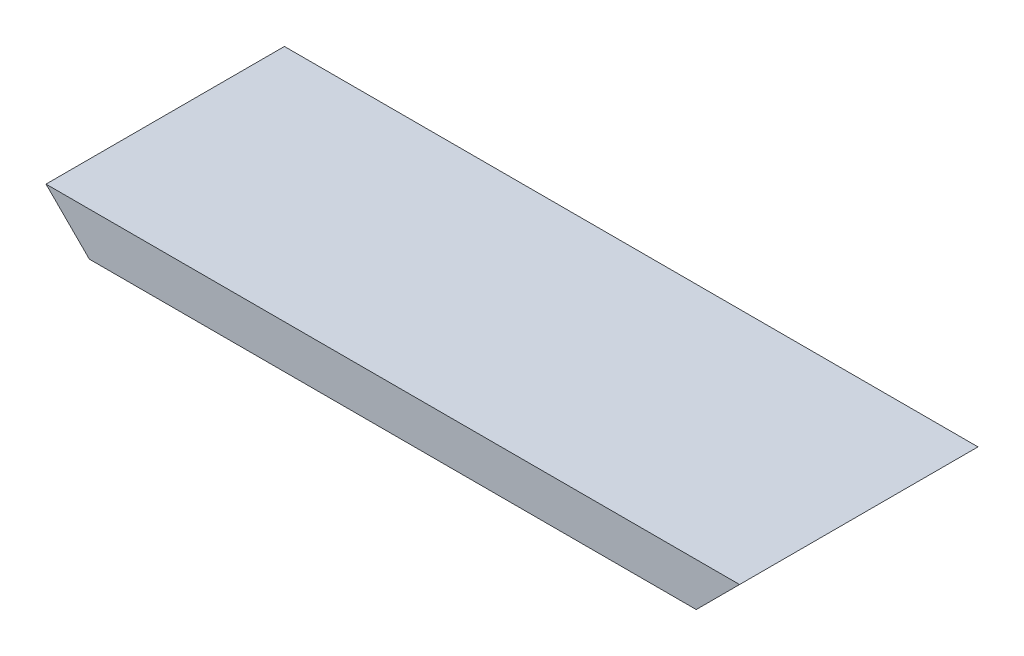
ISO-10303-21;
HEADER;
FILE_DESCRIPTION(('STEP AP214'),'2;1');
FILE_NAME('part.step','',(''),(''),'','','');
FILE_SCHEMA(('AUTOMOTIVE_DESIGN { 1 0 10303 214 1 1 1 1 }'));
ENDSEC;
DATA;
#1=APPLICATION_CONTEXT('core data for automotive mechanical design processes');
#2=APPLICATION_PROTOCOL_DEFINITION('international standard','automotive_design',2000,#1);
#3=PRODUCT_CONTEXT('',#1,'mechanical');
#4=PRODUCT('Part','Part','',(#3));
#5=PRODUCT_RELATED_PRODUCT_CATEGORY('part','',(#4));
#6=PRODUCT_DEFINITION_FORMATION('','',#4);
#7=PRODUCT_DEFINITION_CONTEXT('part definition',#1,'design');
#8=PRODUCT_DEFINITION('design','',#6,#7);
#9=PRODUCT_DEFINITION_SHAPE('','',#8);
#10=(LENGTH_UNIT() NAMED_UNIT(*) SI_UNIT(.MILLI.,.METRE.));
#11=(NAMED_UNIT(*) PLANE_ANGLE_UNIT() SI_UNIT($,.RADIAN.));
#12=(NAMED_UNIT(*) SI_UNIT($,.STERADIAN.) SOLID_ANGLE_UNIT());
#13=UNCERTAINTY_MEASURE_WITH_UNIT(LENGTH_MEASURE(1.E-05),#10,'distance_accuracy_value','');
#14=(GEOMETRIC_REPRESENTATION_CONTEXT(3) GLOBAL_UNCERTAINTY_ASSIGNED_CONTEXT((#13)) GLOBAL_UNIT_ASSIGNED_CONTEXT((#10,
#11,#12)) REPRESENTATION_CONTEXT('',''));
#15=CARTESIAN_POINT('',(0.,0.,0.));
#16=DIRECTION('',(0.,0.,1.));
#17=DIRECTION('',(1.,0.,0.));
#18=AXIS2_PLACEMENT_3D('',#15,#16,#17);
#19=CARTESIAN_POINT('',(-101.6,-6.35,69.85));
#20=DIRECTION('',(0.,1.,0.));
#21=DIRECTION('',(0.,0.,1.));
#22=AXIS2_PLACEMENT_3D('',#19,#20,#21);
#23=PLANE('',#22);
#24=DIRECTION('',(0.,0.,-1.));
#25=VECTOR('',#24,1.);
#26=CARTESIAN_POINT('',(-88.9,-6.35,69.85));
#27=LINE('',#26,#25);
#28=CARTESIAN_POINT('',(-88.9,-6.35,63.5));
#29=VERTEX_POINT('',#28);
#30=CARTESIAN_POINT('',(-88.9,-6.35,57.15));
#31=VERTEX_POINT('',#30);
#32=EDGE_CURVE('E171',#29,#31,#27,.T.);
#33=ORIENTED_EDGE('',*,*,#32,.T.);
#34=DIRECTION('',(-1.,0.,0.));
#35=VECTOR('',#34,1.);
#36=CARTESIAN_POINT('',(-101.6,-6.35,57.15));
#37=LINE('',#36,#35);
#38=CARTESIAN_POINT('',(88.8999999999999,-6.35,57.15));
#39=VERTEX_POINT('',#38);
#40=EDGE_CURVE('E164',#39,#31,#37,.T.);
#41=ORIENTED_EDGE('',*,*,#40,.F.);
#42=DIRECTION('',(0.,0.,1.));
#43=VECTOR('',#42,1.);
#44=CARTESIAN_POINT('',(88.8999999999999,-6.35,69.85));
#45=LINE('',#44,#43);
#46=CARTESIAN_POINT('',(88.8999999999999,-6.35,63.5));
#47=VERTEX_POINT('',#46);
#48=EDGE_CURVE('E276',#39,#47,#45,.T.);
#49=ORIENTED_EDGE('',*,*,#48,.T.);
#50=DIRECTION('',(1.,0.,0.));
#51=VECTOR('',#50,1.);
#52=CARTESIAN_POINT('',(-101.6,-6.35,63.5));
#53=LINE('',#52,#51);
#54=EDGE_CURVE('E242',#29,#47,#53,.T.);
#55=ORIENTED_EDGE('',*,*,#54,.F.);
#56=EDGE_LOOP('',(#33,#41,#49,#55));
#57=FACE_BOUND('',#56,.T.);
#58=ADVANCED_FACE('F34',(#57),#23,.F.);
#59=CARTESIAN_POINT('',(88.8999999999999,-6.35,6.175000096));
#60=VERTEX_POINT('',#59);
#61=CARTESIAN_POINT('',(88.8999999999999,-6.35,54.149999904));
#62=VERTEX_POINT('',#61);
#63=EDGE_CURVE('E163',#60,#62,#45,.T.);
#64=ORIENTED_EDGE('',*,*,#63,.T.);
#65=DIRECTION('',(1.,0.,0.));
#66=VECTOR('',#65,1.);
#67=CARTESIAN_POINT('',(-101.6,-6.35,54.149999904));
#68=LINE('',#67,#66);
#69=CARTESIAN_POINT('',(-88.9,-6.35,54.149999904));
#70=VERTEX_POINT('',#69);
#71=EDGE_CURVE('E148',#70,#62,#68,.T.);
#72=ORIENTED_EDGE('',*,*,#71,.F.);
#73=CARTESIAN_POINT('',(-88.9,-6.35,6.175000096));
#74=VERTEX_POINT('',#73);
#75=EDGE_CURVE('E160',#70,#74,#27,.T.);
#76=ORIENTED_EDGE('',*,*,#75,.T.);
#77=DIRECTION('',(-1.,0.,0.));
#78=VECTOR('',#77,1.);
#79=CARTESIAN_POINT('',(-101.6,-6.35,6.175000096));
#80=LINE('',#79,#78);
#81=EDGE_CURVE('E232',#60,#74,#80,.T.);
#82=ORIENTED_EDGE('',*,*,#81,.F.);
#83=EDGE_LOOP('',(#64,#72,#76,#82));
#84=FACE_BOUND('',#83,.T.);
#85=ADVANCED_FACE('F158',(#84),#23,.F.);
#86=CARTESIAN_POINT('',(-88.9,-6.35,69.85));
#87=VERTEX_POINT('',#86);
#88=CARTESIAN_POINT('',(-88.9,-6.35,66.675));
#89=VERTEX_POINT('',#88);
#90=EDGE_CURVE('E174',#87,#89,#27,.T.);
#91=ORIENTED_EDGE('',*,*,#90,.T.);
#92=DIRECTION('',(-1.,0.,0.));
#93=VECTOR('',#92,1.);
#94=CARTESIAN_POINT('',(-101.6,-6.35,66.675));
#95=LINE('',#94,#93);
#96=CARTESIAN_POINT('',(88.8999999999999,-6.35,66.675));
#97=VERTEX_POINT('',#96);
#98=EDGE_CURVE('E246',#97,#89,#95,.T.);
#99=ORIENTED_EDGE('',*,*,#98,.F.);
#100=CARTESIAN_POINT('',(88.8999999999999,-6.35000000000001,69.85));
#101=VERTEX_POINT('',#100);
#102=EDGE_CURVE('E274',#97,#101,#45,.T.);
#103=ORIENTED_EDGE('',*,*,#102,.T.);
#104=DIRECTION('',(1.,0.,0.));
#105=VECTOR('',#104,1.);
#106=CARTESIAN_POINT('',(-101.6,-6.35,69.85));
#107=LINE('',#106,#105);
#108=EDGE_CURVE('E262',#87,#101,#107,.T.);
#109=ORIENTED_EDGE('',*,*,#108,.F.);
#110=EDGE_LOOP('',(#91,#99,#103,#109));
#111=FACE_BOUND('',#110,.T.);
#112=ADVANCED_FACE('F281',(#111),#23,.F.);
#113=CARTESIAN_POINT('',(-101.6,6.35,69.85));
#114=DIRECTION('',(0.,-1.,0.));
#115=DIRECTION('',(0.,0.,-1.));
#116=AXIS2_PLACEMENT_3D('',#113,#114,#115);
#117=PLANE('',#116);
#118=DIRECTION('',(-1.,0.,0.));
#119=VECTOR('',#118,1.);
#120=CARTESIAN_POINT('',(-101.6,6.35,0.));
#121=LINE('',#120,#119);
#122=CARTESIAN_POINT('',(101.6,6.35,0.));
#123=VERTEX_POINT('',#122);
#124=CARTESIAN_POINT('',(-101.6,6.35,0.));
#125=VERTEX_POINT('',#124);
#126=EDGE_CURVE('E259',#123,#125,#121,.T.);
#127=ORIENTED_EDGE('',*,*,#126,.T.);
#128=DIRECTION('',(0.,0.,-1.));
#129=VECTOR('',#128,1.);
#130=CARTESIAN_POINT('',(-101.6,6.35,69.85));
#131=LINE('',#130,#129);
#132=CARTESIAN_POINT('',(-101.6,6.35,69.85));
#133=VERTEX_POINT('',#132);
#134=EDGE_CURVE('E266',#133,#125,#131,.T.);
#135=ORIENTED_EDGE('',*,*,#134,.F.);
#136=DIRECTION('',(-1.,0.,0.));
#137=VECTOR('',#136,1.);
#138=CARTESIAN_POINT('',(-101.6,6.35,69.85));
#139=LINE('',#138,#137);
#140=CARTESIAN_POINT('',(101.6,6.35,69.85));
#141=VERTEX_POINT('',#140);
#142=EDGE_CURVE('E260',#141,#133,#139,.T.);
#143=ORIENTED_EDGE('',*,*,#142,.F.);
#144=DIRECTION('',(0.,0.,-1.));
#145=VECTOR('',#144,1.);
#146=CARTESIAN_POINT('',(101.6,6.35,69.85));
#147=LINE('',#146,#145);
#148=EDGE_CURVE('E272',#141,#123,#147,.T.);
#149=ORIENTED_EDGE('',*,*,#148,.T.);
#150=EDGE_LOOP('',(#127,#135,#143,#149));
#151=FACE_BOUND('',#150,.T.);
#152=ADVANCED_FACE('F290',(#151),#117,.F.);
#153=CARTESIAN_POINT('',(88.8999999999999,-6.35,0.));
#154=VERTEX_POINT('',#153);
#155=CARTESIAN_POINT('',(88.8999999999999,-6.35,3.175));
#156=VERTEX_POINT('',#155);
#157=EDGE_CURVE('E176',#154,#156,#45,.T.);
#158=ORIENTED_EDGE('',*,*,#157,.T.);
#159=DIRECTION('',(1.,0.,0.));
#160=VECTOR('',#159,1.);
#161=CARTESIAN_POINT('',(-101.6,-6.35,3.175));
#162=LINE('',#161,#160);
#163=CARTESIAN_POINT('',(-88.9,-6.35,3.175));
#164=VERTEX_POINT('',#163);
#165=EDGE_CURVE('E229',#164,#156,#162,.T.);
#166=ORIENTED_EDGE('',*,*,#165,.F.);
#167=CARTESIAN_POINT('',(-88.9,-6.35,0.));
#168=VERTEX_POINT('',#167);
#169=EDGE_CURVE('E172',#164,#168,#27,.T.);
#170=ORIENTED_EDGE('',*,*,#169,.T.);
#171=DIRECTION('',(1.,0.,0.));
#172=VECTOR('',#171,1.);
#173=CARTESIAN_POINT('',(-101.6,-6.35,0.));
#174=LINE('',#173,#172);
#175=EDGE_CURVE('E263',#168,#154,#174,.T.);
#176=ORIENTED_EDGE('',*,*,#175,.T.);
#177=EDGE_LOOP('',(#158,#166,#170,#176));
#178=FACE_BOUND('',#177,.T.);
#179=ADVANCED_FACE('F309',(#178),#23,.F.);
#180=CARTESIAN_POINT('',(0.,0.,69.85));
#181=DIRECTION('',(0.,0.,-1.));
#182=DIRECTION('',(-1.,0.,0.));
#183=AXIS2_PLACEMENT_3D('',#180,#181,#182);
#184=PLANE('',#183);
#185=ORIENTED_EDGE('',*,*,#142,.T.);
#186=DIRECTION('',(-0.707106781186546,0.707106781186549,0.));
#187=VECTOR('',#186,1.);
#188=CARTESIAN_POINT('',(-88.9,-6.35,69.85));
#189=LINE('',#188,#187);
#190=EDGE_CURVE('E194',#133,#87,#189,.F.);
#191=ORIENTED_EDGE('',*,*,#190,.T.);
#192=ORIENTED_EDGE('',*,*,#108,.T.);
#193=DIRECTION('',(-0.707106781186548,-0.707106781186547,0.));
#194=VECTOR('',#193,1.);
#195=CARTESIAN_POINT('',(101.6,6.35000000000002,69.85));
#196=LINE('',#195,#194);
#197=EDGE_CURVE('E190',#101,#141,#196,.F.);
#198=ORIENTED_EDGE('',*,*,#197,.T.);
#199=EDGE_LOOP('',(#185,#191,#192,#198));
#200=FACE_BOUND('',#199,.T.);
#201=ADVANCED_FACE('F285',(#200),#184,.F.);
#202=CARTESIAN_POINT('',(0.,0.,0.));
#203=DIRECTION('',(0.,0.,-1.));
#204=DIRECTION('',(-1.,0.,0.));
#205=AXIS2_PLACEMENT_3D('',#202,#203,#204);
#206=PLANE('',#205);
#207=ORIENTED_EDGE('',*,*,#175,.F.);
#208=DIRECTION('',(0.707106781186546,-0.707106781186549,0.));
#209=VECTOR('',#208,1.);
#210=CARTESIAN_POINT('',(-47.6250000000002,-47.625,0.));
#211=LINE('',#210,#209);
#212=EDGE_CURVE('E185',#168,#125,#211,.F.);
#213=ORIENTED_EDGE('',*,*,#212,.T.);
#214=ORIENTED_EDGE('',*,*,#126,.F.);
#215=DIRECTION('',(0.707106781186548,0.707106781186547,0.));
#216=VECTOR('',#215,1.);
#217=CARTESIAN_POINT('',(47.6249999999999,-47.625,0.));
#218=LINE('',#217,#216);
#219=EDGE_CURVE('E180',#123,#154,#218,.F.);
#220=ORIENTED_EDGE('',*,*,#219,.T.);
#221=EDGE_LOOP('',(#207,#213,#214,#220));
#222=FACE_BOUND('',#221,.T.);
#223=ADVANCED_FACE('F320',(#222),#206,.T.);
#224=CARTESIAN_POINT('',(-88.9,-6.35,69.85));
#225=DIRECTION('',(0.707106781186549,0.707106781186546,0.));
#226=DIRECTION('',(0.,0.,-1.));
#227=AXIS2_PLACEMENT_3D('',#224,#225,#226);
#228=PLANE('',#227);
#229=DIRECTION('',(0.707106781186546,-0.707106781186549,0.));
#230=VECTOR('',#229,1.);
#231=CARTESIAN_POINT('',(-88.9,-6.35,57.15));
#232=LINE('',#231,#230);
#233=CARTESIAN_POINT('',(-92.075,-3.175,57.15));
#234=VERTEX_POINT('',#233);
#235=EDGE_CURVE('E153',#31,#234,#232,.F.);
#236=ORIENTED_EDGE('',*,*,#235,.F.);
#237=ORIENTED_EDGE('',*,*,#32,.F.);
#238=DIRECTION('',(-0.707106781186546,0.707106781186549,0.));
#239=VECTOR('',#238,1.);
#240=CARTESIAN_POINT('',(-88.9,-6.35,63.5));
#241=LINE('',#240,#239);
#242=CARTESIAN_POINT('',(-92.075,-3.175,63.5));
#243=VERTEX_POINT('',#242);
#244=EDGE_CURVE('E255',#243,#29,#241,.F.);
#245=ORIENTED_EDGE('',*,*,#244,.F.);
#246=DIRECTION('',(0.,0.,-1.));
#247=VECTOR('',#246,1.);
#248=CARTESIAN_POINT('',(-92.075,-3.175,69.85));
#249=LINE('',#248,#247);
#250=CARTESIAN_POINT('',(-92.075,-3.175,66.675));
#251=VERTEX_POINT('',#250);
#252=EDGE_CURVE('E249',#243,#251,#249,.F.);
#253=ORIENTED_EDGE('',*,*,#252,.T.);
#254=DIRECTION('',(0.707106781186546,-0.707106781186549,0.));
#255=VECTOR('',#254,1.);
#256=CARTESIAN_POINT('',(-88.9,-6.35,66.675));
#257=LINE('',#256,#255);
#258=EDGE_CURVE('E257',#89,#251,#257,.F.);
#259=ORIENTED_EDGE('',*,*,#258,.F.);
#260=ORIENTED_EDGE('',*,*,#90,.F.);
#261=ORIENTED_EDGE('',*,*,#190,.F.);
#262=ORIENTED_EDGE('',*,*,#134,.T.);
#263=ORIENTED_EDGE('',*,*,#212,.F.);
#264=ORIENTED_EDGE('',*,*,#169,.F.);
#265=DIRECTION('',(-0.707106781186546,0.707106781186549,0.));
#266=VECTOR('',#265,1.);
#267=CARTESIAN_POINT('',(-88.9,-6.35,3.175));
#268=LINE('',#267,#266);
#269=CARTESIAN_POINT('',(-92.075,-3.175,3.175));
#270=VERTEX_POINT('',#269);
#271=EDGE_CURVE('E239',#270,#164,#268,.F.);
#272=ORIENTED_EDGE('',*,*,#271,.F.);
#273=DIRECTION('',(0.,0.,-1.));
#274=VECTOR('',#273,1.);
#275=CARTESIAN_POINT('',(-92.075,-3.175,69.85));
#276=LINE('',#275,#274);
#277=CARTESIAN_POINT('',(-92.075,-3.175,6.175000096));
#278=VERTEX_POINT('',#277);
#279=EDGE_CURVE('E235',#270,#278,#276,.F.);
#280=ORIENTED_EDGE('',*,*,#279,.T.);
#281=DIRECTION('',(0.707106781186546,-0.707106781186549,0.));
#282=VECTOR('',#281,1.);
#283=CARTESIAN_POINT('',(-88.9,-6.35,6.175000096));
#284=LINE('',#283,#282);
#285=EDGE_CURVE('E170',#74,#278,#284,.F.);
#286=ORIENTED_EDGE('',*,*,#285,.F.);
#287=ORIENTED_EDGE('',*,*,#75,.F.);
#288=DIRECTION('',(-0.707106781186546,0.707106781186549,0.));
#289=VECTOR('',#288,1.);
#290=CARTESIAN_POINT('',(-88.9,-6.35,54.149999904));
#291=LINE('',#290,#289);
#292=CARTESIAN_POINT('',(-92.075,-3.175,54.149999904));
#293=VERTEX_POINT('',#292);
#294=EDGE_CURVE('E145',#293,#70,#291,.F.);
#295=ORIENTED_EDGE('',*,*,#294,.F.);
#296=DIRECTION('',(0.,0.,-1.));
#297=VECTOR('',#296,1.);
#298=CARTESIAN_POINT('',(-92.075,-3.175,69.85));
#299=LINE('',#298,#297);
#300=EDGE_CURVE('E154',#293,#234,#299,.F.);
#301=ORIENTED_EDGE('',*,*,#300,.T.);
#302=EDGE_LOOP('',(#236,#237,#245,#253,#259,#260,#261,#262,#263,#264,#272,#280,#286,#287,#295,#301));
#303=FACE_BOUND('',#302,.T.);
#304=ADVANCED_FACE('F168',(#303),#228,.F.);
#305=CARTESIAN_POINT('',(101.6,6.35000000000002,69.85));
#306=DIRECTION('',(-0.707106781186547,0.707106781186548,0.));
#307=DIRECTION('',(0.,0.,-1.));
#308=AXIS2_PLACEMENT_3D('',#305,#306,#307);
#309=PLANE('',#308);
#310=DIRECTION('',(0.707106781186548,0.707106781186547,0.));
#311=VECTOR('',#310,1.);
#312=CARTESIAN_POINT('',(101.6,6.35000000000002,57.15));
#313=LINE('',#312,#311);
#314=CARTESIAN_POINT('',(92.075,-3.175,57.15));
#315=VERTEX_POINT('',#314);
#316=EDGE_CURVE('E11',#315,#39,#313,.F.);
#317=ORIENTED_EDGE('',*,*,#316,.F.);
#318=DIRECTION('',(0.,0.,1.));
#319=VECTOR('',#318,1.);
#320=CARTESIAN_POINT('',(92.075,-3.175,69.85));
#321=LINE('',#320,#319);
#322=CARTESIAN_POINT('',(92.075,-3.175,54.149999904));
#323=VERTEX_POINT('',#322);
#324=EDGE_CURVE('E211',#315,#323,#321,.F.);
#325=ORIENTED_EDGE('',*,*,#324,.T.);
#326=DIRECTION('',(-0.707106781186548,-0.707106781186547,0.));
#327=VECTOR('',#326,1.);
#328=CARTESIAN_POINT('',(101.6,6.35000000000002,54.149999904));
#329=LINE('',#328,#327);
#330=EDGE_CURVE('E42',#62,#323,#329,.F.);
#331=ORIENTED_EDGE('',*,*,#330,.F.);
#332=ORIENTED_EDGE('',*,*,#63,.F.);
#333=DIRECTION('',(0.707106781186548,0.707106781186547,0.));
#334=VECTOR('',#333,1.);
#335=CARTESIAN_POINT('',(101.6,6.35000000000002,6.175000096));
#336=LINE('',#335,#334);
#337=CARTESIAN_POINT('',(92.075,-3.175,6.175000096));
#338=VERTEX_POINT('',#337);
#339=EDGE_CURVE('E209',#338,#60,#336,.F.);
#340=ORIENTED_EDGE('',*,*,#339,.F.);
#341=DIRECTION('',(0.,0.,1.));
#342=VECTOR('',#341,1.);
#343=CARTESIAN_POINT('',(92.075,-3.175,69.85));
#344=LINE('',#343,#342);
#345=CARTESIAN_POINT('',(92.075,-3.175,3.175));
#346=VERTEX_POINT('',#345);
#347=EDGE_CURVE('E204',#338,#346,#344,.F.);
#348=ORIENTED_EDGE('',*,*,#347,.T.);
#349=DIRECTION('',(-0.707106781186548,-0.707106781186547,0.));
#350=VECTOR('',#349,1.);
#351=CARTESIAN_POINT('',(101.6,6.35000000000002,3.175));
#352=LINE('',#351,#350);
#353=EDGE_CURVE('E207',#156,#346,#352,.F.);
#354=ORIENTED_EDGE('',*,*,#353,.F.);
#355=ORIENTED_EDGE('',*,*,#157,.F.);
#356=ORIENTED_EDGE('',*,*,#219,.F.);
#357=ORIENTED_EDGE('',*,*,#148,.F.);
#358=ORIENTED_EDGE('',*,*,#197,.F.);
#359=ORIENTED_EDGE('',*,*,#102,.F.);
#360=DIRECTION('',(0.707106781186548,0.707106781186547,0.));
#361=VECTOR('',#360,1.);
#362=CARTESIAN_POINT('',(101.6,6.35000000000002,66.675));
#363=LINE('',#362,#361);
#364=CARTESIAN_POINT('',(92.075,-3.175,66.675));
#365=VERTEX_POINT('',#364);
#366=EDGE_CURVE('E202',#365,#97,#363,.F.);
#367=ORIENTED_EDGE('',*,*,#366,.F.);
#368=DIRECTION('',(0.,0.,1.));
#369=VECTOR('',#368,1.);
#370=CARTESIAN_POINT('',(92.075,-3.175,69.85));
#371=LINE('',#370,#369);
#372=CARTESIAN_POINT('',(92.075,-3.175,63.5));
#373=VERTEX_POINT('',#372);
#374=EDGE_CURVE('E196',#365,#373,#371,.F.);
#375=ORIENTED_EDGE('',*,*,#374,.T.);
#376=DIRECTION('',(-0.707106781186548,-0.707106781186547,0.));
#377=VECTOR('',#376,1.);
#378=CARTESIAN_POINT('',(101.6,6.35000000000002,63.5));
#379=LINE('',#378,#377);
#380=EDGE_CURVE('E199',#47,#373,#379,.F.);
#381=ORIENTED_EDGE('',*,*,#380,.F.);
#382=ORIENTED_EDGE('',*,*,#48,.F.);
#383=EDGE_LOOP('',(#317,#325,#331,#332,#340,#348,#354,#355,#356,#357,#358,#359,#367,#375,#381,#382));
#384=FACE_BOUND('',#383,.T.);
#385=ADVANCED_FACE('F36',(#384),#309,.F.);
#386=CARTESIAN_POINT('',(-101.6,-3.175,66.675));
#387=DIRECTION('',(0.,0.,1.));
#388=DIRECTION('',(1.,0.,0.));
#389=AXIS2_PLACEMENT_3D('',#386,#387,#388);
#390=PLANE('',#389);
#391=ORIENTED_EDGE('',*,*,#258,.T.);
#392=DIRECTION('',(-1.,0.,0.));
#393=VECTOR('',#392,1.);
#394=CARTESIAN_POINT('',(-101.6,-3.175,66.675));
#395=LINE('',#394,#393);
#396=EDGE_CURVE('E245',#365,#251,#395,.T.);
#397=ORIENTED_EDGE('',*,*,#396,.F.);
#398=ORIENTED_EDGE('',*,*,#366,.T.);
#399=ORIENTED_EDGE('',*,*,#98,.T.);
#400=EDGE_LOOP('',(#391,#397,#398,#399));
#401=FACE_BOUND('',#400,.T.);
#402=ADVANCED_FACE('F297',(#401),#390,.F.);
#403=CARTESIAN_POINT('',(-101.6,-3.175,63.5));
#404=DIRECTION('',(0.,0.,-1.));
#405=DIRECTION('',(-1.,0.,0.));
#406=AXIS2_PLACEMENT_3D('',#403,#404,#405);
#407=PLANE('',#406);
#408=ORIENTED_EDGE('',*,*,#244,.T.);
#409=ORIENTED_EDGE('',*,*,#54,.T.);
#410=ORIENTED_EDGE('',*,*,#380,.T.);
#411=DIRECTION('',(1.,0.,0.));
#412=VECTOR('',#411,1.);
#413=CARTESIAN_POINT('',(-101.6,-3.175,63.5));
#414=LINE('',#413,#412);
#415=EDGE_CURVE('E243',#243,#373,#414,.T.);
#416=ORIENTED_EDGE('',*,*,#415,.F.);
#417=EDGE_LOOP('',(#408,#409,#410,#416));
#418=FACE_BOUND('',#417,.T.);
#419=ADVANCED_FACE('F303',(#418),#407,.F.);
#420=CARTESIAN_POINT('',(0.,-3.175,0.));
#421=DIRECTION('',(0.,-1.,0.));
#422=DIRECTION('',(0.,0.,-1.));
#423=AXIS2_PLACEMENT_3D('',#420,#421,#422);
#424=PLANE('',#423);
#425=ORIENTED_EDGE('',*,*,#415,.T.);
#426=ORIENTED_EDGE('',*,*,#374,.F.);
#427=ORIENTED_EDGE('',*,*,#396,.T.);
#428=ORIENTED_EDGE('',*,*,#252,.F.);
#429=EDGE_LOOP('',(#425,#426,#427,#428));
#430=FACE_BOUND('',#429,.T.);
#431=ADVANCED_FACE('F299',(#430),#424,.T.);
#432=CARTESIAN_POINT('',(-101.6,-3.175,6.175000096));
#433=DIRECTION('',(0.,0.,1.));
#434=DIRECTION('',(1.,0.,0.));
#435=AXIS2_PLACEMENT_3D('',#432,#433,#434);
#436=PLANE('',#435);
#437=ORIENTED_EDGE('',*,*,#285,.T.);
#438=DIRECTION('',(-1.,0.,0.));
#439=VECTOR('',#438,1.);
#440=CARTESIAN_POINT('',(-101.6,-3.175,6.175000096));
#441=LINE('',#440,#439);
#442=EDGE_CURVE('E231',#338,#278,#441,.T.);
#443=ORIENTED_EDGE('',*,*,#442,.F.);
#444=ORIENTED_EDGE('',*,*,#339,.T.);
#445=ORIENTED_EDGE('',*,*,#81,.T.);
#446=EDGE_LOOP('',(#437,#443,#444,#445));
#447=FACE_BOUND('',#446,.T.);
#448=ADVANCED_FACE('F394',(#447),#436,.F.);
#449=CARTESIAN_POINT('',(-101.6,-3.175,3.175));
#450=DIRECTION('',(0.,0.,-1.));
#451=DIRECTION('',(-1.,0.,0.));
#452=AXIS2_PLACEMENT_3D('',#449,#450,#451);
#453=PLANE('',#452);
#454=ORIENTED_EDGE('',*,*,#271,.T.);
#455=ORIENTED_EDGE('',*,*,#165,.T.);
#456=ORIENTED_EDGE('',*,*,#353,.T.);
#457=DIRECTION('',(1.,0.,0.));
#458=VECTOR('',#457,1.);
#459=CARTESIAN_POINT('',(-101.6,-3.175,3.175));
#460=LINE('',#459,#458);
#461=EDGE_CURVE('E57',#270,#346,#460,.T.);
#462=ORIENTED_EDGE('',*,*,#461,.F.);
#463=EDGE_LOOP('',(#454,#455,#456,#462));
#464=FACE_BOUND('',#463,.T.);
#465=ADVANCED_FACE('F401',(#464),#453,.F.);
#466=CARTESIAN_POINT('',(0.,-3.175,0.));
#467=DIRECTION('',(0.,-1.,0.));
#468=DIRECTION('',(0.,0.,-1.));
#469=AXIS2_PLACEMENT_3D('',#466,#467,#468);
#470=PLANE('',#469);
#471=ORIENTED_EDGE('',*,*,#461,.T.);
#472=ORIENTED_EDGE('',*,*,#347,.F.);
#473=ORIENTED_EDGE('',*,*,#442,.T.);
#474=ORIENTED_EDGE('',*,*,#279,.F.);
#475=EDGE_LOOP('',(#471,#472,#473,#474));
#476=FACE_BOUND('',#475,.T.);
#477=ADVANCED_FACE('F409',(#476),#470,.T.);
#478=CARTESIAN_POINT('',(-101.6,-3.175,57.15));
#479=DIRECTION('',(0.,0.,1.));
#480=DIRECTION('',(1.,0.,0.));
#481=AXIS2_PLACEMENT_3D('',#478,#479,#480);
#482=PLANE('',#481);
#483=ORIENTED_EDGE('',*,*,#235,.T.);
#484=DIRECTION('',(-1.,0.,0.));
#485=VECTOR('',#484,1.);
#486=CARTESIAN_POINT('',(-101.6,-3.175,57.15));
#487=LINE('',#486,#485);
#488=EDGE_CURVE('E219',#315,#234,#487,.T.);
#489=ORIENTED_EDGE('',*,*,#488,.F.);
#490=ORIENTED_EDGE('',*,*,#316,.T.);
#491=ORIENTED_EDGE('',*,*,#40,.T.);
#492=EDGE_LOOP('',(#483,#489,#490,#491));
#493=FACE_BOUND('',#492,.T.);
#494=ADVANCED_FACE('F221',(#493),#482,.F.);
#495=CARTESIAN_POINT('',(-101.6,-3.175,54.149999904));
#496=DIRECTION('',(0.,0.,-1.));
#497=DIRECTION('',(-1.,0.,0.));
#498=AXIS2_PLACEMENT_3D('',#495,#496,#497);
#499=PLANE('',#498);
#500=ORIENTED_EDGE('',*,*,#294,.T.);
#501=ORIENTED_EDGE('',*,*,#71,.T.);
#502=ORIENTED_EDGE('',*,*,#330,.T.);
#503=DIRECTION('',(1.,0.,0.));
#504=VECTOR('',#503,1.);
#505=CARTESIAN_POINT('',(-101.6,-3.175,54.149999904));
#506=LINE('',#505,#504);
#507=EDGE_CURVE('E49',#293,#323,#506,.T.);
#508=ORIENTED_EDGE('',*,*,#507,.F.);
#509=EDGE_LOOP('',(#500,#501,#502,#508));
#510=FACE_BOUND('',#509,.T.);
#511=ADVANCED_FACE('F147',(#510),#499,.F.);
#512=CARTESIAN_POINT('',(0.,-3.175,0.));
#513=DIRECTION('',(0.,-1.,0.));
#514=DIRECTION('',(0.,0.,-1.));
#515=AXIS2_PLACEMENT_3D('',#512,#513,#514);
#516=PLANE('',#515);
#517=ORIENTED_EDGE('',*,*,#507,.T.);
#518=ORIENTED_EDGE('',*,*,#324,.F.);
#519=ORIENTED_EDGE('',*,*,#488,.T.);
#520=ORIENTED_EDGE('',*,*,#300,.F.);
#521=EDGE_LOOP('',(#517,#518,#519,#520));
#522=FACE_BOUND('',#521,.T.);
#523=ADVANCED_FACE('F218',(#522),#516,.T.);
#524=CLOSED_SHELL('',(#58,#85,#112,#152,#179,#201,#223,#304,#385,#402,#419,#431,#448,#465,#477,
#494,#511,#523));
#525=MANIFOLD_SOLID_BREP('B2',#524);
#526=ADVANCED_BREP_SHAPE_REPRESENTATION('',(#18,#525),#14);
#527=SHAPE_DEFINITION_REPRESENTATION(#9,#526);
ENDSEC;
END-ISO-10303-21;
